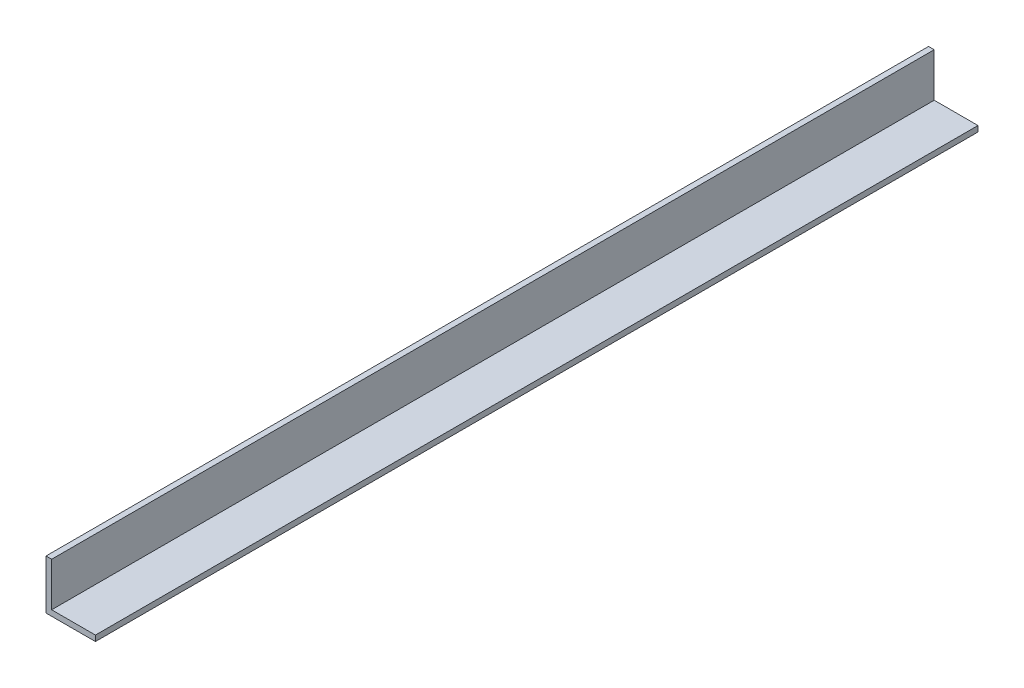
ISO-10303-21;
HEADER;
FILE_DESCRIPTION(('STEP AP214'),'2;1');
FILE_NAME('part.step','',(''),(''),'','','');
FILE_SCHEMA(('AUTOMOTIVE_DESIGN { 1 0 10303 214 1 1 1 1 }'));
ENDSEC;
DATA;
#1=APPLICATION_CONTEXT('core data for automotive mechanical design processes');
#2=APPLICATION_PROTOCOL_DEFINITION('international standard','automotive_design',2000,#1);
#3=PRODUCT_CONTEXT('',#1,'mechanical');
#4=PRODUCT('Part','Part','',(#3));
#5=PRODUCT_RELATED_PRODUCT_CATEGORY('part','',(#4));
#6=PRODUCT_DEFINITION_FORMATION('','',#4);
#7=PRODUCT_DEFINITION_CONTEXT('part definition',#1,'design');
#8=PRODUCT_DEFINITION('design','',#6,#7);
#9=PRODUCT_DEFINITION_SHAPE('','',#8);
#10=(LENGTH_UNIT() NAMED_UNIT(*) SI_UNIT(.MILLI.,.METRE.));
#11=(NAMED_UNIT(*) PLANE_ANGLE_UNIT() SI_UNIT($,.RADIAN.));
#12=(NAMED_UNIT(*) SI_UNIT($,.STERADIAN.) SOLID_ANGLE_UNIT());
#13=UNCERTAINTY_MEASURE_WITH_UNIT(LENGTH_MEASURE(1.E-05),#10,'distance_accuracy_value','');
#14=(GEOMETRIC_REPRESENTATION_CONTEXT(3) GLOBAL_UNCERTAINTY_ASSIGNED_CONTEXT((#13)) GLOBAL_UNIT_ASSIGNED_CONTEXT((#10,
#11,#12)) REPRESENTATION_CONTEXT('',''));
#15=CARTESIAN_POINT('',(0.,0.,0.));
#16=DIRECTION('',(0.,0.,1.));
#17=DIRECTION('',(1.,0.,0.));
#18=AXIS2_PLACEMENT_3D('',#15,#16,#17);
#19=CARTESIAN_POINT('',(-27.,70.,1250.));
#20=DIRECTION('',(0.,-1.,0.));
#21=DIRECTION('',(1.,0.,0.));
#22=AXIS2_PLACEMENT_3D('',#19,#20,#21);
#23=PLANE('',#22);
#24=DIRECTION('',(-1.,0.,0.));
#25=VECTOR('',#24,1.);
#26=CARTESIAN_POINT('',(-27.,70.,0.));
#27=LINE('',#26,#25);
#28=CARTESIAN_POINT('',(-27.,70.,0.));
#29=VERTEX_POINT('',#28);
#30=CARTESIAN_POINT('',(-35.,70.,0.));
#31=VERTEX_POINT('',#30);
#32=EDGE_CURVE('E119',#29,#31,#27,.T.);
#33=ORIENTED_EDGE('',*,*,#32,.T.);
#34=DIRECTION('',(0.,0.,-1.));
#35=VECTOR('',#34,1.);
#36=CARTESIAN_POINT('',(-35.,70.,1250.));
#37=LINE('',#36,#35);
#38=CARTESIAN_POINT('',(-35.,70.,1250.));
#39=VERTEX_POINT('',#38);
#40=EDGE_CURVE('E11',#39,#31,#37,.T.);
#41=ORIENTED_EDGE('',*,*,#40,.F.);
#42=DIRECTION('',(-1.,0.,0.));
#43=VECTOR('',#42,1.);
#44=CARTESIAN_POINT('',(-27.,70.,1250.));
#45=LINE('',#44,#43);
#46=CARTESIAN_POINT('',(-27.,70.,1250.));
#47=VERTEX_POINT('',#46);
#48=EDGE_CURVE('E129',#47,#39,#45,.T.);
#49=ORIENTED_EDGE('',*,*,#48,.F.);
#50=DIRECTION('',(0.,0.,-1.));
#51=VECTOR('',#50,1.);
#52=CARTESIAN_POINT('',(-27.,70.,1250.));
#53=LINE('',#52,#51);
#54=EDGE_CURVE('E115',#47,#29,#53,.T.);
#55=ORIENTED_EDGE('',*,*,#54,.T.);
#56=EDGE_LOOP('',(#33,#41,#49,#55));
#57=FACE_BOUND('',#56,.T.);
#58=ADVANCED_FACE('F35',(#57),#23,.F.);
#59=CARTESIAN_POINT('',(-35.,70.,1250.));
#60=DIRECTION('',(1.,0.,0.));
#61=DIRECTION('',(0.,0.,-1.));
#62=AXIS2_PLACEMENT_3D('',#59,#60,#61);
#63=PLANE('',#62);
#64=DIRECTION('',(0.,-1.,0.));
#65=VECTOR('',#64,1.);
#66=CARTESIAN_POINT('',(-35.,70.,0.));
#67=LINE('',#66,#65);
#68=CARTESIAN_POINT('',(-35.,0.,0.));
#69=VERTEX_POINT('',#68);
#70=EDGE_CURVE('E122',#31,#69,#67,.T.);
#71=ORIENTED_EDGE('',*,*,#70,.T.);
#72=DIRECTION('',(0.,0.,-1.));
#73=VECTOR('',#72,1.);
#74=CARTESIAN_POINT('',(-35.,0.,1250.));
#75=LINE('',#74,#73);
#76=CARTESIAN_POINT('',(-35.,0.,1250.));
#77=VERTEX_POINT('',#76);
#78=EDGE_CURVE('E43',#77,#69,#75,.T.);
#79=ORIENTED_EDGE('',*,*,#78,.F.);
#80=DIRECTION('',(0.,-1.,0.));
#81=VECTOR('',#80,1.);
#82=CARTESIAN_POINT('',(-35.,70.,1250.));
#83=LINE('',#82,#81);
#84=EDGE_CURVE('E88',#39,#77,#83,.T.);
#85=ORIENTED_EDGE('',*,*,#84,.F.);
#86=ORIENTED_EDGE('',*,*,#40,.T.);
#87=EDGE_LOOP('',(#71,#79,#85,#86));
#88=FACE_BOUND('',#87,.T.);
#89=ADVANCED_FACE('F153',(#88),#63,.F.);
#90=CARTESIAN_POINT('',(-35.,0.,1250.));
#91=DIRECTION('',(0.,1.,0.));
#92=DIRECTION('',(-1.,0.,0.));
#93=AXIS2_PLACEMENT_3D('',#90,#91,#92);
#94=PLANE('',#93);
#95=DIRECTION('',(1.,0.,0.));
#96=VECTOR('',#95,1.);
#97=CARTESIAN_POINT('',(-35.,0.,0.));
#98=LINE('',#97,#96);
#99=CARTESIAN_POINT('',(35.,0.,0.));
#100=VERTEX_POINT('',#99);
#101=EDGE_CURVE('E124',#69,#100,#98,.T.);
#102=ORIENTED_EDGE('',*,*,#101,.T.);
#103=DIRECTION('',(0.,0.,-1.));
#104=VECTOR('',#103,1.);
#105=CARTESIAN_POINT('',(35.,0.,1250.));
#106=LINE('',#105,#104);
#107=CARTESIAN_POINT('',(35.,0.,1250.));
#108=VERTEX_POINT('',#107);
#109=EDGE_CURVE('E110',#108,#100,#106,.T.);
#110=ORIENTED_EDGE('',*,*,#109,.F.);
#111=DIRECTION('',(1.,0.,0.));
#112=VECTOR('',#111,1.);
#113=CARTESIAN_POINT('',(-35.,0.,1250.));
#114=LINE('',#113,#112);
#115=EDGE_CURVE('E101',#77,#108,#114,.T.);
#116=ORIENTED_EDGE('',*,*,#115,.F.);
#117=ORIENTED_EDGE('',*,*,#78,.T.);
#118=EDGE_LOOP('',(#102,#110,#116,#117));
#119=FACE_BOUND('',#118,.T.);
#120=ADVANCED_FACE('F135',(#119),#94,.F.);
#121=CARTESIAN_POINT('',(35.,0.,1250.));
#122=DIRECTION('',(-1.,0.,0.));
#123=DIRECTION('',(0.,0.,1.));
#124=AXIS2_PLACEMENT_3D('',#121,#122,#123);
#125=PLANE('',#124);
#126=DIRECTION('',(0.,1.,0.));
#127=VECTOR('',#126,1.);
#128=CARTESIAN_POINT('',(35.,0.,0.));
#129=LINE('',#128,#127);
#130=CARTESIAN_POINT('',(35.,7.99999999999999,0.));
#131=VERTEX_POINT('',#130);
#132=EDGE_CURVE('E109',#100,#131,#129,.T.);
#133=ORIENTED_EDGE('',*,*,#132,.T.);
#134=DIRECTION('',(0.,0.,-1.));
#135=VECTOR('',#134,1.);
#136=CARTESIAN_POINT('',(35.,7.99999999999999,1250.));
#137=LINE('',#136,#135);
#138=CARTESIAN_POINT('',(35.,7.99999999999999,1250.));
#139=VERTEX_POINT('',#138);
#140=EDGE_CURVE('E106',#139,#131,#137,.T.);
#141=ORIENTED_EDGE('',*,*,#140,.F.);
#142=DIRECTION('',(0.,1.,0.));
#143=VECTOR('',#142,1.);
#144=CARTESIAN_POINT('',(35.,0.,1250.));
#145=LINE('',#144,#143);
#146=EDGE_CURVE('E95',#108,#139,#145,.T.);
#147=ORIENTED_EDGE('',*,*,#146,.F.);
#148=ORIENTED_EDGE('',*,*,#109,.T.);
#149=EDGE_LOOP('',(#133,#141,#147,#148));
#150=FACE_BOUND('',#149,.T.);
#151=ADVANCED_FACE('F107',(#150),#125,.F.);
#152=CARTESIAN_POINT('',(35.,7.99999999999999,1250.));
#153=DIRECTION('',(0.,-1.,0.));
#154=DIRECTION('',(1.,0.,0.));
#155=AXIS2_PLACEMENT_3D('',#152,#153,#154);
#156=PLANE('',#155);
#157=DIRECTION('',(-1.,0.,0.));
#158=VECTOR('',#157,1.);
#159=CARTESIAN_POINT('',(35.,7.99999999999999,0.));
#160=LINE('',#159,#158);
#161=CARTESIAN_POINT('',(-27.,8.,0.));
#162=VERTEX_POINT('',#161);
#163=EDGE_CURVE('E74',#131,#162,#160,.T.);
#164=ORIENTED_EDGE('',*,*,#163,.T.);
#165=DIRECTION('',(0.,0.,-1.));
#166=VECTOR('',#165,1.);
#167=CARTESIAN_POINT('',(-27.,8.,1250.));
#168=LINE('',#167,#166);
#169=CARTESIAN_POINT('',(-27.,8.,1250.));
#170=VERTEX_POINT('',#169);
#171=EDGE_CURVE('E111',#170,#162,#168,.T.);
#172=ORIENTED_EDGE('',*,*,#171,.F.);
#173=DIRECTION('',(-1.,0.,0.));
#174=VECTOR('',#173,1.);
#175=CARTESIAN_POINT('',(35.,7.99999999999999,1250.));
#176=LINE('',#175,#174);
#177=EDGE_CURVE('E99',#139,#170,#176,.T.);
#178=ORIENTED_EDGE('',*,*,#177,.F.);
#179=ORIENTED_EDGE('',*,*,#140,.T.);
#180=EDGE_LOOP('',(#164,#172,#178,#179));
#181=FACE_BOUND('',#180,.T.);
#182=ADVANCED_FACE('F113',(#181),#156,.F.);
#183=CARTESIAN_POINT('',(-27.,8.,1250.));
#184=DIRECTION('',(-1.,0.,0.));
#185=DIRECTION('',(0.,0.,1.));
#186=AXIS2_PLACEMENT_3D('',#183,#184,#185);
#187=PLANE('',#186);
#188=DIRECTION('',(0.,1.,0.));
#189=VECTOR('',#188,1.);
#190=CARTESIAN_POINT('',(-27.,8.,0.));
#191=LINE('',#190,#189);
#192=EDGE_CURVE('E80',#162,#29,#191,.T.);
#193=ORIENTED_EDGE('',*,*,#192,.T.);
#194=ORIENTED_EDGE('',*,*,#54,.F.);
#195=DIRECTION('',(0.,1.,0.));
#196=VECTOR('',#195,1.);
#197=CARTESIAN_POINT('',(-27.,8.,1250.));
#198=LINE('',#197,#196);
#199=EDGE_CURVE('E51',#170,#47,#198,.T.);
#200=ORIENTED_EDGE('',*,*,#199,.F.);
#201=ORIENTED_EDGE('',*,*,#171,.T.);
#202=EDGE_LOOP('',(#193,#194,#200,#201));
#203=FACE_BOUND('',#202,.T.);
#204=ADVANCED_FACE('F142',(#203),#187,.F.);
#205=CARTESIAN_POINT('',(0.,0.,1250.));
#206=DIRECTION('',(0.,0.,1.));
#207=DIRECTION('',(1.,0.,0.));
#208=AXIS2_PLACEMENT_3D('',#205,#206,#207);
#209=PLANE('',#208);
#210=ORIENTED_EDGE('',*,*,#48,.T.);
#211=ORIENTED_EDGE('',*,*,#84,.T.);
#212=ORIENTED_EDGE('',*,*,#115,.T.);
#213=ORIENTED_EDGE('',*,*,#146,.T.);
#214=ORIENTED_EDGE('',*,*,#177,.T.);
#215=ORIENTED_EDGE('',*,*,#199,.T.);
#216=EDGE_LOOP('',(#210,#211,#212,#213,#214,#215));
#217=FACE_BOUND('',#216,.T.);
#218=ADVANCED_FACE('F97',(#217),#209,.T.);
#219=CARTESIAN_POINT('',(0.,0.,0.));
#220=DIRECTION('',(0.,0.,1.));
#221=DIRECTION('',(1.,0.,0.));
#222=AXIS2_PLACEMENT_3D('',#219,#220,#221);
#223=PLANE('',#222);
#224=ORIENTED_EDGE('',*,*,#32,.F.);
#225=ORIENTED_EDGE('',*,*,#192,.F.);
#226=ORIENTED_EDGE('',*,*,#163,.F.);
#227=ORIENTED_EDGE('',*,*,#132,.F.);
#228=ORIENTED_EDGE('',*,*,#101,.F.);
#229=ORIENTED_EDGE('',*,*,#70,.F.);
#230=EDGE_LOOP('',(#224,#225,#226,#227,#228,#229));
#231=FACE_BOUND('',#230,.T.);
#232=ADVANCED_FACE('F138',(#231),#223,.F.);
#233=CLOSED_SHELL('',(#58,#89,#120,#151,#182,#204,#218,#232));
#234=MANIFOLD_SOLID_BREP('B2',#233);
#235=ADVANCED_BREP_SHAPE_REPRESENTATION('',(#18,#234),#14);
#236=SHAPE_DEFINITION_REPRESENTATION(#9,#235);
ENDSEC;
END-ISO-10303-21;
